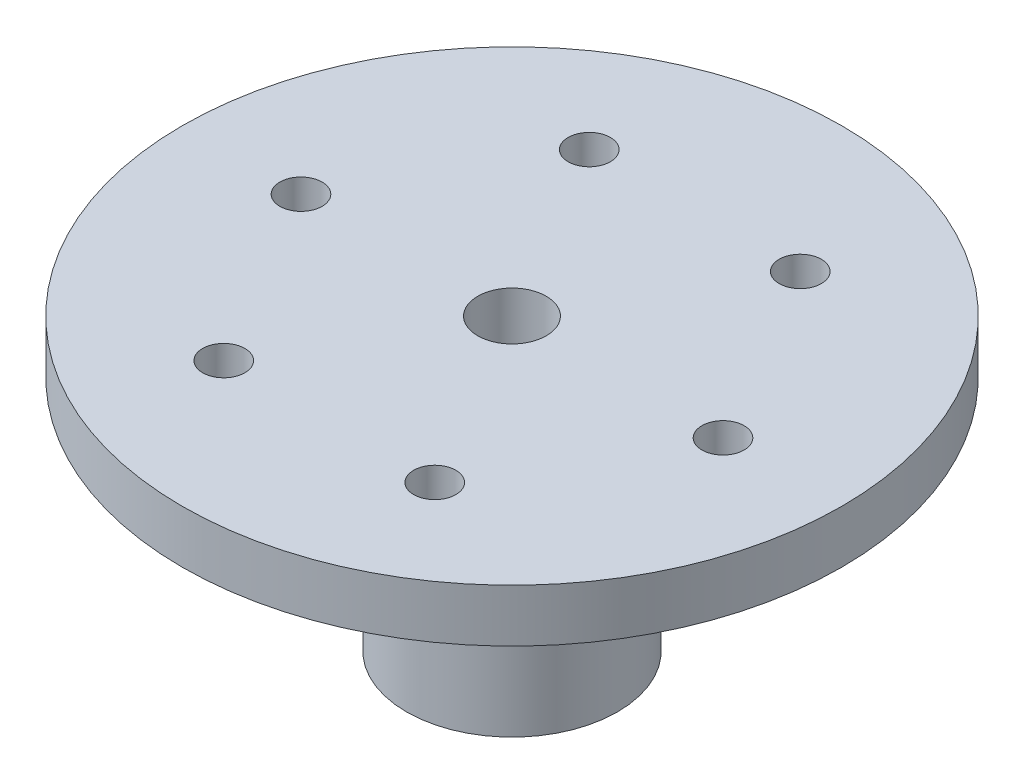
ISO-10303-21;
HEADER;
FILE_DESCRIPTION(('STEP AP214'),'2;1');
FILE_NAME('part.step','',(''),(''),'','','');
FILE_SCHEMA(('AUTOMOTIVE_DESIGN { 1 0 10303 214 1 1 1 1 }'));
ENDSEC;
DATA;
#1=APPLICATION_CONTEXT('core data for automotive mechanical design processes');
#2=APPLICATION_PROTOCOL_DEFINITION('international standard','automotive_design',2000,#1);
#3=PRODUCT_CONTEXT('',#1,'mechanical');
#4=PRODUCT('Part','Part','',(#3));
#5=PRODUCT_RELATED_PRODUCT_CATEGORY('part','',(#4));
#6=PRODUCT_DEFINITION_FORMATION('','',#4);
#7=PRODUCT_DEFINITION_CONTEXT('part definition',#1,'design');
#8=PRODUCT_DEFINITION('design','',#6,#7);
#9=PRODUCT_DEFINITION_SHAPE('','',#8);
#10=(LENGTH_UNIT() NAMED_UNIT(*) SI_UNIT(.MILLI.,.METRE.));
#11=(NAMED_UNIT(*) PLANE_ANGLE_UNIT() SI_UNIT($,.RADIAN.));
#12=(NAMED_UNIT(*) SI_UNIT($,.STERADIAN.) SOLID_ANGLE_UNIT());
#13=UNCERTAINTY_MEASURE_WITH_UNIT(LENGTH_MEASURE(1.E-05),#10,'distance_accuracy_value','');
#14=(GEOMETRIC_REPRESENTATION_CONTEXT(3) GLOBAL_UNCERTAINTY_ASSIGNED_CONTEXT((#13)) GLOBAL_UNIT_ASSIGNED_CONTEXT((#10,
#11,#12)) REPRESENTATION_CONTEXT('',''));
#15=CARTESIAN_POINT('',(0.,0.,0.));
#16=DIRECTION('',(0.,0.,1.));
#17=DIRECTION('',(1.,0.,0.));
#18=AXIS2_PLACEMENT_3D('',#15,#16,#17);
#19=CARTESIAN_POINT('',(0.,0.,0.));
#20=DIRECTION('',(0.,1.,0.));
#21=DIRECTION('',(0.,0.,1.));
#22=AXIS2_PLACEMENT_3D('',#19,#20,#21);
#23=PLANE('',#22);
#24=CARTESIAN_POINT('',(0.,0.,0.));
#25=DIRECTION('',(0.,1.,0.));
#26=DIRECTION('',(0.,0.,1.));
#27=AXIS2_PLACEMENT_3D('',#24,#25,#26);
#28=CIRCLE('',#27,8.);
#29=CARTESIAN_POINT('',(0.,0.,8.));
#30=VERTEX_POINT('',#29);
#31=EDGE_CURVE('E44',#30,#30,#28,.T.);
#32=ORIENTED_EDGE('',*,*,#31,.F.);
#33=EDGE_LOOP('',(#32));
#34=FACE_BOUND('',#33,.T.);
#35=CARTESIAN_POINT('',(0.,0.,0.));
#36=DIRECTION('',(0.,1.,0.));
#37=DIRECTION('',(0.,0.,1.));
#38=AXIS2_PLACEMENT_3D('',#35,#36,#37);
#39=CIRCLE('',#38,2.6);
#40=CARTESIAN_POINT('',(0.,0.,2.6));
#41=VERTEX_POINT('',#40);
#42=EDGE_CURVE('E49',#41,#41,#39,.T.);
#43=ORIENTED_EDGE('',*,*,#42,.T.);
#44=EDGE_LOOP('',(#43));
#45=FACE_BOUND('',#44,.T.);
#46=ADVANCED_FACE('F35',(#34,#45),#23,.F.);
#47=CARTESIAN_POINT('',(0.,18.,0.));
#48=DIRECTION('',(0.,-1.,0.));
#49=DIRECTION('',(0.,0.,-1.));
#50=AXIS2_PLACEMENT_3D('',#47,#48,#49);
#51=CYLINDRICAL_SURFACE('',#50,8.);
#52=CARTESIAN_POINT('',(0.,12.4,-8.));
#53=CARTESIAN_POINT('',(-0.13166178040528,12.3999984040242,-7.9999988680088));
#54=CARTESIAN_POINT('',(-0.263339709362447,12.3891298182017,-7.99671865110326));
#55=CARTESIAN_POINT('',(-0.522861000487809,12.3460458332446,-7.98395368949906));
#56=CARTESIAN_POINT('',(-0.650703207058272,12.3138240671627,-7.97446709423507));
#57=CARTESIAN_POINT('',(-0.898772332407242,12.2292063729436,-7.95032884002938));
#58=CARTESIAN_POINT('',(-1.0190101830326,12.1768402086097,-7.93568480400681));
#59=CARTESIAN_POINT('',(-1.24899868968501,12.0535422511107,-7.90275374780233));
#60=CARTESIAN_POINT('',(-1.35874794795147,11.9826079881673,-7.88446624307307));
#61=CARTESIAN_POINT('',(-1.56779487549399,11.8220415880437,-7.84561179508438));
#62=CARTESIAN_POINT('',(-1.66674891399095,11.7319733985825,-7.82499813851258));
#63=CARTESIAN_POINT('',(-1.84839873477318,11.5366252321437,-7.78409334736707));
#64=CARTESIAN_POINT('',(-1.93109178123905,11.4313427006001,-7.76380226759202));
#65=CARTESIAN_POINT('',(-2.07968060357932,11.2056467951398,-7.72534582390035));
#66=CARTESIAN_POINT('',(-2.14515694435541,11.0849464624148,-7.707238506622));
#67=CARTESIAN_POINT('',(-2.25474231639617,10.8336171932315,-7.6758979263045));
#68=CARTESIAN_POINT('',(-2.29885647871957,10.7029906497152,-7.66266349301297));
#69=CARTESIAN_POINT('',(-2.36322613892243,10.4393755741913,-7.64305393341495));
#70=CARTESIAN_POINT('',(-2.38411513975484,10.3065556098177,-7.63649710919253));
#71=CARTESIAN_POINT('',(-2.40341968983475,10.0391469500532,-7.63044463599628));
#72=CARTESIAN_POINT('',(-2.40184068417725,9.90455869110546,-7.63094727616914));
#73=CARTESIAN_POINT('',(-2.37675163519699,9.64258574622643,-7.63879590508444));
#74=CARTESIAN_POINT('',(-2.35403528420296,9.51511639942042,-7.64589421758625));
#75=CARTESIAN_POINT('',(-2.28859872683289,9.26588834196247,-7.66573369965799));
#76=CARTESIAN_POINT('',(-2.24587654626625,9.14413019620107,-7.67847542611761));
#77=CARTESIAN_POINT('',(-2.14105642645891,8.90783944054282,-7.70836372919957));
#78=CARTESIAN_POINT('',(-2.07870107095428,8.79342866567158,-7.72556825785523));
#79=CARTESIAN_POINT('',(-1.93656356141893,8.57642876478369,-7.76241579200103));
#80=CARTESIAN_POINT('',(-1.85677718404141,8.47384251293796,-7.78205938795186));
#81=CARTESIAN_POINT('',(-1.67810065224874,8.27890209478077,-7.822576180767));
#82=CARTESIAN_POINT('',(-1.57855185194715,8.18715413755253,-7.84346646896797));
#83=CARTESIAN_POINT('',(-1.36522121490235,8.0215136254972,-7.88339590501214));
#84=CARTESIAN_POINT('',(-1.25143848297742,7.94762219453692,-7.90243493629456));
#85=CARTESIAN_POINT('',(-1.01176806134848,7.81942412405643,-7.93669056111152));
#86=CARTESIAN_POINT('',(-0.88580439959672,7.76525197400022,-7.95188069869302));
#87=CARTESIAN_POINT('',(-0.625992664965631,7.67904065584059,-7.97653634931555));
#88=CARTESIAN_POINT('',(-0.49214680254333,7.64699531434802,-7.98600345899199));
#89=CARTESIAN_POINT('',(-0.22552358826933,7.60695651536097,-7.99789383429661));
#90=CARTESIAN_POINT('',(-0.0928801561618992,7.59814146271742,-8.00055760668464));
#91=CARTESIAN_POINT('',(0.171999369317413,7.60251064913933,-7.99924677186816));
#92=CARTESIAN_POINT('',(0.304235514705249,7.61569195144231,-7.99527305084411));
#93=CARTESIAN_POINT('',(0.561445768495515,7.66301537777839,-7.9812911517946));
#94=CARTESIAN_POINT('',(0.686516436182671,7.69667742012939,-7.97142127679063));
#95=CARTESIAN_POINT('',(0.929207422327235,7.78342917244512,-7.94678956546456));
#96=CARTESIAN_POINT('',(1.04682684324093,7.83652121766058,-7.9320271411375));
#97=CARTESIAN_POINT('',(1.27429950313768,7.96200506476981,-7.89871446962105));
#98=CARTESIAN_POINT('',(1.38391012191947,8.03481494551677,-7.88008449327424));
#99=CARTESIAN_POINT('',(1.58963729276824,8.19715960648449,-7.84117550022964));
#100=CARTESIAN_POINT('',(1.68575045176951,8.28669857902024,-7.82089607089936));
#101=CARTESIAN_POINT('',(1.86537191281642,8.48381969339099,-7.78005074990405));
#102=CARTESIAN_POINT('',(1.94829569970401,8.59193900123492,-7.75950120052411));
#103=CARTESIAN_POINT('',(2.0948639211545,8.82100470242151,-7.72122424382359));
#104=CARTESIAN_POINT('',(2.15850886127172,8.94195075929261,-7.70349676250497));
#105=CARTESIAN_POINT('',(2.26427755403453,9.19285198600803,-7.67307503381048));
#106=CARTESIAN_POINT('',(2.30650155099217,9.32276189846053,-7.660357405388));
#107=CARTESIAN_POINT('',(2.36834769304245,9.58830075028838,-7.64146550991789));
#108=CARTESIAN_POINT('',(2.38797758366279,9.72392771325286,-7.6352890005551));
#109=CARTESIAN_POINT('',(2.40355175175944,9.99097842942147,-7.63039955953247));
#110=CARTESIAN_POINT('',(2.40044888492709,10.1223418416791,-7.63138635760316));
#111=CARTESIAN_POINT('',(2.37292008710888,10.382582565441,-7.63999041913751));
#112=CARTESIAN_POINT('',(2.34849500999526,10.5114599762888,-7.64760741708721));
#113=CARTESIAN_POINT('',(2.27963022086949,10.7615126386107,-7.66841221911394));
#114=CARTESIAN_POINT('',(2.23544280811398,10.8827636597739,-7.68152967283947));
#115=CARTESIAN_POINT('',(2.12850411393718,11.1162279021132,-7.71184446244212));
#116=CARTESIAN_POINT('',(2.06574927940578,11.2284393882265,-7.72904257908064));
#117=CARTESIAN_POINT('',(1.9207802208814,11.445060986442,-7.7663628228427));
#118=CARTESIAN_POINT('',(1.83794041748797,11.5490380180163,-7.78656864262864));
#119=CARTESIAN_POINT('',(1.65627895407644,11.7419239972929,-7.82722112719253));
#120=CARTESIAN_POINT('',(1.55745314741518,11.8308290231485,-7.84766785318034));
#121=CARTESIAN_POINT('',(1.34314521949322,11.9936374596719,-7.88721498513258));
#122=CARTESIAN_POINT('',(1.22726061726498,12.0670263149688,-7.90625855625137));
#123=CARTESIAN_POINT('',(0.984226198373643,12.1931762718465,-7.94017088729242));
#124=CARTESIAN_POINT('',(0.857081684798327,12.2459470212392,-7.95504159889691));
#125=CARTESIAN_POINT('',(0.609212340248452,12.3246324410444,-7.97763479950895));
#126=CARTESIAN_POINT('',(0.489259139126775,12.3528186766132,-7.98595243809712));
#127=CARTESIAN_POINT('',(0.246208312369247,12.3905016403865,-7.99713511191184));
#128=CARTESIAN_POINT('',(0.123111215773023,12.4000014923277,-8.00000105847583));
#129=CARTESIAN_POINT('',(0.,12.4,-8.));
#130=B_SPLINE_CURVE_WITH_KNOTS('',3,(#52,#53,#54,#55,#56,#57,#58,#59,#60,#61,#62,#63,#64,#65,
#66,#67,#68,#69,#70,#71,#72,#73,#74,#75,#76,#77,#78,#79,#80,#81,#82,#83,#84,#85,#86,#87,#88,#89,
#90,#91,#92,#93,#94,#95,#96,#97,#98,#99,#100,#101,#102,#103,#104,#105,#106,#107,#108,#109,#110,
#111,#112,#113,#114,#115,#116,#117,#118,#119,#120,#121,#122,#123,#124,#125,#126,#127,#128,#129),
.UNSPECIFIED.,.T.,.F.,(4,2,2,2,2,2,2,2,2,2,2,2,2,2,2,2,2,2,2,2,2,2,2,2,2,2,2,2,2,2,2,2,2,2,2,2,
2,2,4),(0.,0.394533125780177,0.789183943753599,1.1832538820814,1.57737626306032,
1.98168964717106,2.38607099661813,2.79954369606574,3.21291703269158,3.61471502970558,
4.01641565310543,4.40361626716281,4.79085509852802,5.18339882315391,5.57603776253689,
5.98507366477067,6.39413530449714,6.80593675010702,7.21762325646092,7.61454095101672,
8.01140565680523,8.39930794691723,8.78725687349966,9.18418089124653,9.58120451200306,
9.99264640516509,10.4040775080429,10.81356503922,11.2229121513645,11.6152024875083,
12.0074771146586,12.3948806465165,12.7823583609227,13.1839508109519,13.585647598433,
13.9990879385797,14.4123345855967,14.7813070709603,15.150217871255),.UNSPECIFIED.);
#131=CARTESIAN_POINT('',(0.,12.4,-8.));
#132=VERTEX_POINT('',#131);
#133=EDGE_CURVE('E60',#132,#132,#130,.T.);
#134=ORIENTED_EDGE('',*,*,#133,.T.);
#135=EDGE_LOOP('',(#134));
#136=FACE_BOUND('',#135,.T.);
#137=CARTESIAN_POINT('',(0.,18.,0.));
#138=DIRECTION('',(0.,1.,0.));
#139=DIRECTION('',(0.,0.,1.));
#140=AXIS2_PLACEMENT_3D('',#137,#138,#139);
#141=CIRCLE('',#140,8.);
#142=CARTESIAN_POINT('',(0.,18.,8.));
#143=VERTEX_POINT('',#142);
#144=EDGE_CURVE('E10',#143,#143,#141,.T.);
#145=ORIENTED_EDGE('',*,*,#144,.F.);
#146=EDGE_LOOP('',(#145));
#147=FACE_BOUND('',#146,.T.);
#148=ORIENTED_EDGE('',*,*,#31,.T.);
#149=EDGE_LOOP('',(#148));
#150=FACE_BOUND('',#149,.T.);
#151=ADVANCED_FACE('F37',(#136,#147,#150),#51,.T.);
#152=CARTESIAN_POINT('',(0.,18.,0.));
#153=DIRECTION('',(0.,-1.,0.));
#154=DIRECTION('',(0.,0.,-1.));
#155=AXIS2_PLACEMENT_3D('',#152,#153,#154);
#156=CYLINDRICAL_SURFACE('',#155,2.6);
#157=CARTESIAN_POINT('',(0.,12.4,-2.6));
#158=CARTESIAN_POINT('',(-0.110253293289517,12.3999918557324,-2.59999193091976));
#159=CARTESIAN_POINT('',(-0.220578358244194,12.3923396404243,-2.59292376288972));
#160=CARTESIAN_POINT('',(-0.437496805693456,12.36233565564,-2.56526750690049));
#161=CARTESIAN_POINT('',(-0.544085759557477,12.3399670238822,-2.54466390989173));
#162=CARTESIAN_POINT('',(-0.74979699498979,12.2823557462199,-2.49178998062185));
#163=CARTESIAN_POINT('',(-0.848963357748623,12.2471978373515,-2.4595964531508));
#164=CARTESIAN_POINT('',(-1.03881942943321,12.165995582834,-2.38563585985758));
#165=CARTESIAN_POINT('',(-1.12950597486161,12.1199471967932,-2.34386524108891));
#166=CARTESIAN_POINT('',(-1.33628329340981,11.9984870166154,-2.2344982810976));
#167=CARTESIAN_POINT('',(-1.44789529541141,11.9187185518003,-2.1632761864279));
#168=CARTESIAN_POINT('',(-1.65259463663395,11.7455634384784,-2.01128516755018));
#169=CARTESIAN_POINT('',(-1.74563749150799,11.6521449949053,-1.93049403964585));
#170=CARTESIAN_POINT('',(-1.91578353736409,11.4517247963353,-1.7619308261401));
#171=CARTESIAN_POINT('',(-1.99243414172537,11.3444436060945,-1.67403529419028));
#172=CARTESIAN_POINT('',(-2.09359001406653,11.1752338022373,-1.54270757935254));
#173=CARTESIAN_POINT('',(-2.12499174782237,11.1174834178291,-1.49904160814595));
#174=CARTESIAN_POINT('',(-2.18323658091873,10.9989212370194,-1.41285960541424));
#175=CARTESIAN_POINT('',(-2.21008196509532,10.9381109949732,-1.37034300656918));
#176=CARTESIAN_POINT('',(-2.25843926672024,10.814692854847,-1.2890403557874));
#177=CARTESIAN_POINT('',(-2.28007914215949,10.7521825156896,-1.25018329889018));
#178=CARTESIAN_POINT('',(-2.31869327576771,10.6230600987196,-1.17701513661225));
#179=CARTESIAN_POINT('',(-2.33566673139453,10.5564473177675,-1.14270481371476));
#180=CARTESIAN_POINT('',(-2.36199331033766,10.4295141888592,-1.08709725093047));
#181=CARTESIAN_POINT('',(-2.37213286185081,10.369904087534,-1.06459469789769));
#182=CARTESIAN_POINT('',(-2.38799151571338,10.2475229275543,-1.02854070687548));
#183=CARTESIAN_POINT('',(-2.39372618070245,10.1847638397451,-1.01495778040557));
#184=CARTESIAN_POINT('',(-2.39967397973977,10.067044078534,-1.00080884778861));
#185=CARTESIAN_POINT('',(-2.40058615721642,10.0123252692066,-0.998596287013188));
#186=CARTESIAN_POINT('',(-2.39867279663049,9.90333317636697,-1.00318129599667));
#187=CARTESIAN_POINT('',(-2.39584554880426,9.84906010807859,-1.00998298731168));
#188=CARTESIAN_POINT('',(-2.38526167036109,9.72512501226766,-1.03477209113681));
#189=CARTESIAN_POINT('',(-2.37620361223052,9.65618136967142,-1.05567207158032));
#190=CARTESIAN_POINT('',(-2.35300223384909,9.52247069801654,-1.1064130282759));
#191=CARTESIAN_POINT('',(-2.33883559809615,9.45772445084281,-1.13629489194383));
#192=CARTESIAN_POINT('',(-2.30615209349664,9.33227993842859,-1.20124426916695));
#193=CARTESIAN_POINT('',(-2.28764231813448,9.27157527758293,-1.23630329281943));
#194=CARTESIAN_POINT('',(-2.2465890600595,9.15338636981,-1.30942760754397));
#195=CARTESIAN_POINT('',(-2.22404158193293,9.09590538746096,-1.3474958552898));
#196=CARTESIAN_POINT('',(-2.17504555153213,8.98366955786592,-1.42523427951782));
#197=CARTESIAN_POINT('',(-2.14859273942495,8.928917775909,-1.46490617045621));
#198=CARTESIAN_POINT('',(-2.09183122908232,8.82190358047085,-1.54487863517501));
#199=CARTESIAN_POINT('',(-2.06152110778427,8.76964209555552,-1.58517943613796));
#200=CARTESIAN_POINT('',(-1.99271328297664,8.6606792914496,-1.6710807554743));
#201=CARTESIAN_POINT('',(-1.95366273708307,8.6043161507154,-1.71667083412421));
#202=CARTESIAN_POINT('',(-1.87049363339439,8.49467918595236,-1.80693925540124));
#203=CARTESIAN_POINT('',(-1.82637321253715,8.44140650848899,-1.85161725571231));
#204=CARTESIAN_POINT('',(-1.68638143299502,8.28668868319559,-1.98303967030674));
#205=CARTESIAN_POINT('',(-1.58267932816001,8.19002290778821,-2.06743236944323));
#206=CARTESIAN_POINT('',(-1.38038763130332,8.03355745438999,-2.20588425623087));
#207=CARTESIAN_POINT('',(-1.28611136869555,7.97039279465733,-2.2624551065853));
#208=CARTESIAN_POINT('',(-1.08527168664129,7.85629407273712,-2.3653459383943));
#209=CARTESIAN_POINT('',(-0.978722184030967,7.80534635576523,-2.41167735979777));
#210=CARTESIAN_POINT('',(-0.772707839781748,7.72555337753424,-2.48453014238678));
#211=CARTESIAN_POINT('',(-0.674813375292449,7.6944811401753,-2.51303059624425));
#212=CARTESIAN_POINT('',(-0.473332895418684,7.6448579441416,-2.55863187017592));
#213=CARTESIAN_POINT('',(-0.369750579910114,7.62629894770149,-2.57574000791218));
#214=CARTESIAN_POINT('',(-0.159283116503703,7.60294393470139,-2.59727878899119));
#215=CARTESIAN_POINT('',(-0.0523863121799385,7.59820384387449,-2.6016579172499));
#216=CARTESIAN_POINT('',(0.160804104888001,7.60302073083945,-2.59721172742758));
#217=CARTESIAN_POINT('',(0.267097718944851,7.61257767750584,-2.58838643809333));
#218=CARTESIAN_POINT('',(0.468952574023296,7.64418775502277,-2.55926097628564));
#219=CARTESIAN_POINT('',(0.564763759450772,7.66539472845559,-2.53973801139653));
#220=CARTESIAN_POINT('',(0.750808078141295,7.71840870405212,-2.49109400235789));
#221=CARTESIAN_POINT('',(0.84103936421535,7.75021919440582,-2.46196979976829));
#222=CARTESIAN_POINT('',(1.04489117984069,7.83567386134654,-2.38409135236303));
#223=CARTESIAN_POINT('',(1.15568187442301,7.89306342215937,-2.33203362261787));
#224=CARTESIAN_POINT('',(1.36322831741091,8.02097381422857,-2.21715221253679));
#225=CARTESIAN_POINT('',(1.45995362534403,8.09152239326382,-2.15430580536992));
#226=CARTESIAN_POINT('',(1.66892572651374,8.26819684892617,-1.99918166897158));
#227=CARTESIAN_POINT('',(1.77566718986987,8.37835893267276,-1.90405916898402));
#228=CARTESIAN_POINT('',(1.91739234463406,8.55456092391541,-1.75734441894713));
#229=CARTESIAN_POINT('',(1.96159995235626,8.6151788478256,-1.70772279483686));
#230=CARTESIAN_POINT('',(2.04404915895271,8.74005741862563,-1.60811423616925));
#231=CARTESIAN_POINT('',(2.08229321812292,8.80431654831816,-1.55812746121455));
#232=CARTESIAN_POINT('',(2.16162320035268,8.95302260121251,-1.44676812621891));
#233=CARTESIAN_POINT('',(2.20106894756233,9.03852911631936,-1.38564029210198));
#234=CARTESIAN_POINT('',(2.27055866944337,9.21660802190689,-1.26851620063005));
#235=CARTESIAN_POINT('',(2.30062004216201,9.3091669363669,-1.21251058500128));
#236=CARTESIAN_POINT('',(2.34009171220948,9.4638416828509,-1.13360869748151));
#237=CARTESIAN_POINT('',(2.35291834062775,9.52291090729741,-1.10654344583984));
#238=CARTESIAN_POINT('',(2.37434363553045,9.6446263086212,-1.05978852638494));
#239=CARTESIAN_POINT('',(2.38295289092549,9.70726308166579,-1.04008041632745));
#240=CARTESIAN_POINT('',(2.39411505189458,9.82395094040137,-1.01409245185054));
#241=CARTESIAN_POINT('',(2.39748075331609,9.87751046704464,-1.00603064319251));
#242=CARTESIAN_POINT('',(2.40055871895834,9.98531358361526,-0.998668140367301));
#243=CARTESIAN_POINT('',(2.40027508464513,10.0395563371541,-0.999357610679622));
#244=CARTESIAN_POINT('',(2.39610268908879,10.1468846163791,-1.00931366541283));
#245=CARTESIAN_POINT('',(2.39222530316321,10.1999732528055,-1.01855318617561));
#246=CARTESIAN_POINT('',(2.38123071725832,10.3041275847833,-1.04399805407571));
#247=CARTESIAN_POINT('',(2.37410701829025,10.3551889979177,-1.06021737084191));
#248=CARTESIAN_POINT('',(2.34933382375152,10.4999252716421,-1.11450341987781));
#249=CARTESIAN_POINT('',(2.32798766114701,10.5904568872773,-1.15907490415583));
#250=CARTESIAN_POINT('',(2.27682500682951,10.764423415576,-1.25664460610283));
#251=CARTESIAN_POINT('',(2.24696634405408,10.8478202390575,-1.30968418438331));
#252=CARTESIAN_POINT('',(2.18195995977194,11.0027635603981,-1.41513387523201));
#253=CARTESIAN_POINT('',(2.14738611380935,11.0747290294703,-1.46728589141297));
#254=CARTESIAN_POINT('',(2.07158513226751,11.2144371136431,-1.5724972645583));
#255=CARTESIAN_POINT('',(2.0303531890692,11.2821766279342,-1.625557252204));
#256=CARTESIAN_POINT('',(1.94123743768396,11.413462059328,-1.7309987056811));
#257=CARTESIAN_POINT('',(1.89336536403635,11.4770150888525,-1.7833811940717));
#258=CARTESIAN_POINT('',(1.79076266755269,11.5998665547735,-1.88638727962579));
#259=CARTESIAN_POINT('',(1.73603188654214,11.6591648929994,-1.93701083619066));
#260=CARTESIAN_POINT('',(1.59229958807784,11.799687716632,-2.05842117330693));
#261=CARTESIAN_POINT('',(1.4992241930891,11.8782305736681,-2.1275927969963));
#262=CARTESIAN_POINT('',(1.29775625472815,12.0226540091058,-2.25611573429647));
#263=CARTESIAN_POINT('',(1.1893877134437,12.0885540546991,-2.31548212591208));
#264=CARTESIAN_POINT('',(0.9811912905307,12.1927127727199,-2.40989832317532));
#265=CARTESIAN_POINT('',(0.883950072299776,12.2338621546802,-2.44743605504096));
#266=CARTESIAN_POINT('',(0.681632508874096,12.3036428153785,-2.51128871574601));
#267=CARTESIAN_POINT('',(0.576569362726033,12.3322946465948,-2.53762206865235));
#268=CARTESIAN_POINT('',(0.392560085780078,12.3689600340916,-2.57136886284367));
#269=CARTESIAN_POINT('',(0.314908466872286,12.3805528035406,-2.58205782876094));
#270=CARTESIAN_POINT('',(0.158183649855952,12.396076117517,-2.59637666918156));
#271=CARTESIAN_POINT('',(0.0791103008430451,12.4000058437752,-2.60000578982583));
#272=CARTESIAN_POINT('',(0.,12.4,-2.6));
#273=B_SPLINE_CURVE_WITH_KNOTS('',3,(#157,#158,#159,#160,#161,#162,#163,#164,#165,#166,#167,
#168,#169,#170,#171,#172,#173,#174,#175,#176,#177,#178,#179,#180,#181,#182,#183,#184,#185,#186,
#187,#188,#189,#190,#191,#192,#193,#194,#195,#196,#197,#198,#199,#200,#201,#202,#203,#204,#205,
#206,#207,#208,#209,#210,#211,#212,#213,#214,#215,#216,#217,#218,#219,#220,#221,#222,#223,#224,
#225,#226,#227,#228,#229,#230,#231,#232,#233,#234,#235,#236,#237,#238,#239,#240,#241,#242,#243,
#244,#245,#246,#247,#248,#249,#250,#251,#252,#253,#254,#255,#256,#257,#258,#259,#260,#261,#262,
#263,#264,#265,#266,#267,#268,#269,#270,#271,#272),.UNSPECIFIED.,.T.,.F.,(4,2,2,2,2,2,2,2,2,2,2,
2,2,2,2,2,2,2,2,2,2,2,2,2,2,2,2,2,2,2,2,2,2,2,2,2,2,2,2,2,2,2,2,2,2,2,2,2,2,2,2,2,2,2,2,2,2,4),
(0.,0.330415872296247,0.661211000760351,0.989853175087199,1.31861746820501,1.7797935147992,
2.24206143480355,2.71579490088812,2.95240011262137,3.18888632301922,3.41877142427527,
3.64869603702868,3.84165352651085,4.03392611324847,4.19736571510115,4.36088007167967,
4.57743120465817,4.79498345028965,5.01218281947091,5.22959831289622,5.44725273383049,
5.66498768724787,5.91177833175517,6.15865995791654,6.65105940002156,7.03016806254222,
7.40885100227688,7.72727871784581,8.04550169893705,8.36501076705412,8.68451913958264,
8.98341004708607,9.28239937654632,9.68575425512448,10.0899694860178,10.6283593773976,
10.8980233591214,11.1675757934023,11.5038566860295,11.8395103805391,12.0377744187649,
12.2355380743845,12.3975975819128,12.5594749676798,12.7208417057474,12.8825329224629,
13.1901897431276,13.4993980050284,13.7851239531332,14.0710571458846,14.356491322833,
14.6419320836343,15.0605782771146,15.4785745792677,15.813453065096,16.1477787407829,
16.3848374947218,16.621921560701),.UNSPECIFIED.);
#274=CARTESIAN_POINT('',(0.,12.4,-2.6));
#275=VERTEX_POINT('',#274);
#276=EDGE_CURVE('E53',#275,#275,#273,.T.);
#277=ORIENTED_EDGE('',*,*,#276,.F.);
#278=EDGE_LOOP('',(#277));
#279=FACE_BOUND('',#278,.T.);
#280=ORIENTED_EDGE('',*,*,#42,.F.);
#281=EDGE_LOOP('',(#280));
#282=FACE_BOUND('',#281,.T.);
#283=CARTESIAN_POINT('',(0.,22.,0.));
#284=DIRECTION('',(0.,1.,0.));
#285=DIRECTION('',(0.,0.,1.));
#286=AXIS2_PLACEMENT_3D('',#283,#284,#285);
#287=CIRCLE('',#286,2.6);
#288=CARTESIAN_POINT('',(0.,22.,2.6));
#289=VERTEX_POINT('',#288);
#290=EDGE_CURVE('E40',#289,#289,#287,.T.);
#291=ORIENTED_EDGE('',*,*,#290,.T.);
#292=EDGE_LOOP('',(#291));
#293=FACE_BOUND('',#292,.T.);
#294=ADVANCED_FACE('F61',(#279,#282,#293),#156,.F.);
#295=CARTESIAN_POINT('',(0.,22.,0.));
#296=DIRECTION('',(0.,1.,0.));
#297=DIRECTION('',(0.,0.,1.));
#298=AXIS2_PLACEMENT_3D('',#295,#296,#297);
#299=PLANE('',#298);
#300=ORIENTED_EDGE('',*,*,#290,.F.);
#301=EDGE_LOOP('',(#300));
#302=FACE_BOUND('',#301,.T.);
#303=CARTESIAN_POINT('',(-7.99999999999987,22.,-13.8564064605511));
#304=DIRECTION('',(0.,1.,0.));
#305=DIRECTION('',(0.,0.,1.));
#306=AXIS2_PLACEMENT_3D('',#303,#304,#305);
#307=CIRCLE('',#306,1.6);
#308=CARTESIAN_POINT('',(-7.99999999999987,22.,-12.2564064605511));
#309=VERTEX_POINT('',#308);
#310=EDGE_CURVE('E85',#309,#309,#307,.T.);
#311=ORIENTED_EDGE('',*,*,#310,.F.);
#312=EDGE_LOOP('',(#311));
#313=FACE_BOUND('',#312,.T.);
#314=CARTESIAN_POINT('',(-8.00000000000007,22.,13.856406460551));
#315=DIRECTION('',(0.,1.,0.));
#316=DIRECTION('',(0.,0.,1.));
#317=AXIS2_PLACEMENT_3D('',#314,#315,#316);
#318=CIRCLE('',#317,1.6);
#319=CARTESIAN_POINT('',(-8.00000000000007,22.,15.456406460551));
#320=VERTEX_POINT('',#319);
#321=EDGE_CURVE('E97',#320,#320,#318,.T.);
#322=ORIENTED_EDGE('',*,*,#321,.F.);
#323=EDGE_LOOP('',(#322));
#324=FACE_BOUND('',#323,.T.);
#325=CARTESIAN_POINT('',(16.,22.,0.));
#326=DIRECTION('',(0.,1.,0.));
#327=DIRECTION('',(0.,0.,1.));
#328=AXIS2_PLACEMENT_3D('',#325,#326,#327);
#329=CIRCLE('',#328,1.6);
#330=CARTESIAN_POINT('',(16.,22.,1.6));
#331=VERTEX_POINT('',#330);
#332=EDGE_CURVE('E109',#331,#331,#329,.T.);
#333=ORIENTED_EDGE('',*,*,#332,.F.);
#334=EDGE_LOOP('',(#333));
#335=FACE_BOUND('',#334,.T.);
#336=CARTESIAN_POINT('',(0.,22.,0.));
#337=DIRECTION('',(0.,1.,0.));
#338=DIRECTION('',(0.,0.,1.));
#339=AXIS2_PLACEMENT_3D('',#336,#337,#338);
#340=CIRCLE('',#339,25.);
#341=CARTESIAN_POINT('',(0.,22.,25.));
#342=VERTEX_POINT('',#341);
#343=EDGE_CURVE('E115',#342,#342,#340,.T.);
#344=ORIENTED_EDGE('',*,*,#343,.T.);
#345=EDGE_LOOP('',(#344));
#346=FACE_BOUND('',#345,.T.);
#347=CARTESIAN_POINT('',(7.99999999999997,22.,13.856406460551));
#348=DIRECTION('',(0.,1.,0.));
#349=DIRECTION('',(0.,0.,1.));
#350=AXIS2_PLACEMENT_3D('',#347,#348,#349);
#351=CIRCLE('',#350,1.6);
#352=CARTESIAN_POINT('',(7.99999999999997,22.,15.456406460551));
#353=VERTEX_POINT('',#352);
#354=EDGE_CURVE('E103',#353,#353,#351,.T.);
#355=ORIENTED_EDGE('',*,*,#354,.F.);
#356=EDGE_LOOP('',(#355));
#357=FACE_BOUND('',#356,.T.);
#358=CARTESIAN_POINT('',(-16.,22.,-1.1172740284298E-13));
#359=DIRECTION('',(0.,1.,0.));
#360=DIRECTION('',(0.,0.,1.));
#361=AXIS2_PLACEMENT_3D('',#358,#359,#360);
#362=CIRCLE('',#361,1.6);
#363=CARTESIAN_POINT('',(-16.,22.,1.59999999999989));
#364=VERTEX_POINT('',#363);
#365=EDGE_CURVE('E91',#364,#364,#362,.T.);
#366=ORIENTED_EDGE('',*,*,#365,.F.);
#367=EDGE_LOOP('',(#366));
#368=FACE_BOUND('',#367,.T.);
#369=CARTESIAN_POINT('',(8.00000000000016,22.,-13.8564064605509));
#370=DIRECTION('',(0.,1.,0.));
#371=DIRECTION('',(0.,0.,1.));
#372=AXIS2_PLACEMENT_3D('',#369,#370,#371);
#373=CIRCLE('',#372,1.6);
#374=CARTESIAN_POINT('',(8.00000000000016,22.,-12.2564064605509));
#375=VERTEX_POINT('',#374);
#376=EDGE_CURVE('E79',#375,#375,#373,.T.);
#377=ORIENTED_EDGE('',*,*,#376,.F.);
#378=EDGE_LOOP('',(#377));
#379=FACE_BOUND('',#378,.T.);
#380=ADVANCED_FACE('F125',(#302,#313,#324,#335,#346,#357,#368,#379),#299,.T.);
#381=CARTESIAN_POINT('',(0.,18.,0.));
#382=DIRECTION('',(0.,1.,0.));
#383=DIRECTION('',(0.,0.,1.));
#384=AXIS2_PLACEMENT_3D('',#381,#382,#383);
#385=PLANE('',#384);
#386=ORIENTED_EDGE('',*,*,#144,.T.);
#387=EDGE_LOOP('',(#386));
#388=FACE_BOUND('',#387,.T.);
#389=CARTESIAN_POINT('',(0.,18.,0.));
#390=DIRECTION('',(0.,1.,0.));
#391=DIRECTION('',(0.,0.,1.));
#392=AXIS2_PLACEMENT_3D('',#389,#390,#391);
#393=CIRCLE('',#392,25.);
#394=CARTESIAN_POINT('',(0.,18.,25.));
#395=VERTEX_POINT('',#394);
#396=EDGE_CURVE('E112',#395,#395,#393,.T.);
#397=ORIENTED_EDGE('',*,*,#396,.F.);
#398=EDGE_LOOP('',(#397));
#399=FACE_BOUND('',#398,.T.);
#400=CARTESIAN_POINT('',(16.,18.,0.));
#401=DIRECTION('',(0.,1.,0.));
#402=DIRECTION('',(0.,0.,1.));
#403=AXIS2_PLACEMENT_3D('',#400,#401,#402);
#404=CIRCLE('',#403,1.6);
#405=CARTESIAN_POINT('',(16.,18.,1.6));
#406=VERTEX_POINT('',#405);
#407=EDGE_CURVE('E106',#406,#406,#404,.T.);
#408=ORIENTED_EDGE('',*,*,#407,.T.);
#409=EDGE_LOOP('',(#408));
#410=FACE_BOUND('',#409,.T.);
#411=CARTESIAN_POINT('',(7.99999999999997,18.,13.856406460551));
#412=DIRECTION('',(0.,1.,0.));
#413=DIRECTION('',(0.,0.,1.));
#414=AXIS2_PLACEMENT_3D('',#411,#412,#413);
#415=CIRCLE('',#414,1.6);
#416=CARTESIAN_POINT('',(7.99999999999997,18.,15.456406460551));
#417=VERTEX_POINT('',#416);
#418=EDGE_CURVE('E100',#417,#417,#415,.T.);
#419=ORIENTED_EDGE('',*,*,#418,.T.);
#420=EDGE_LOOP('',(#419));
#421=FACE_BOUND('',#420,.T.);
#422=CARTESIAN_POINT('',(-8.00000000000007,18.,13.856406460551));
#423=DIRECTION('',(0.,1.,0.));
#424=DIRECTION('',(0.,0.,1.));
#425=AXIS2_PLACEMENT_3D('',#422,#423,#424);
#426=CIRCLE('',#425,1.6);
#427=CARTESIAN_POINT('',(-8.00000000000007,18.,15.456406460551));
#428=VERTEX_POINT('',#427);
#429=EDGE_CURVE('E94',#428,#428,#426,.T.);
#430=ORIENTED_EDGE('',*,*,#429,.T.);
#431=EDGE_LOOP('',(#430));
#432=FACE_BOUND('',#431,.T.);
#433=CARTESIAN_POINT('',(-16.,18.,-1.1172740284298E-13));
#434=DIRECTION('',(0.,1.,0.));
#435=DIRECTION('',(0.,0.,1.));
#436=AXIS2_PLACEMENT_3D('',#433,#434,#435);
#437=CIRCLE('',#436,1.6);
#438=CARTESIAN_POINT('',(-16.,18.,1.59999999999989));
#439=VERTEX_POINT('',#438);
#440=EDGE_CURVE('E88',#439,#439,#437,.T.);
#441=ORIENTED_EDGE('',*,*,#440,.T.);
#442=EDGE_LOOP('',(#441));
#443=FACE_BOUND('',#442,.T.);
#444=CARTESIAN_POINT('',(-7.99999999999987,18.,-13.8564064605511));
#445=DIRECTION('',(0.,1.,0.));
#446=DIRECTION('',(0.,0.,1.));
#447=AXIS2_PLACEMENT_3D('',#444,#445,#446);
#448=CIRCLE('',#447,1.6);
#449=CARTESIAN_POINT('',(-7.99999999999987,18.,-12.2564064605511));
#450=VERTEX_POINT('',#449);
#451=EDGE_CURVE('E82',#450,#450,#448,.T.);
#452=ORIENTED_EDGE('',*,*,#451,.T.);
#453=EDGE_LOOP('',(#452));
#454=FACE_BOUND('',#453,.T.);
#455=CARTESIAN_POINT('',(8.00000000000016,18.,-13.8564064605509));
#456=DIRECTION('',(0.,1.,0.));
#457=DIRECTION('',(0.,0.,1.));
#458=AXIS2_PLACEMENT_3D('',#455,#456,#457);
#459=CIRCLE('',#458,1.6);
#460=CARTESIAN_POINT('',(8.00000000000016,18.,-12.2564064605509));
#461=VERTEX_POINT('',#460);
#462=EDGE_CURVE('E78',#461,#461,#459,.T.);
#463=ORIENTED_EDGE('',*,*,#462,.T.);
#464=EDGE_LOOP('',(#463));
#465=FACE_BOUND('',#464,.T.);
#466=ADVANCED_FACE('F122',(#388,#399,#410,#421,#432,#443,#454,#465),#385,.F.);
#467=CARTESIAN_POINT('',(0.,22.,0.));
#468=DIRECTION('',(0.,-1.,0.));
#469=DIRECTION('',(0.,0.,-1.));
#470=AXIS2_PLACEMENT_3D('',#467,#468,#469);
#471=CYLINDRICAL_SURFACE('',#470,25.);
#472=ORIENTED_EDGE('',*,*,#343,.F.);
#473=EDGE_LOOP('',(#472));
#474=FACE_BOUND('',#473,.T.);
#475=ORIENTED_EDGE('',*,*,#396,.T.);
#476=EDGE_LOOP('',(#475));
#477=FACE_BOUND('',#476,.T.);
#478=ADVANCED_FACE('F120',(#474,#477),#471,.T.);
#479=CARTESIAN_POINT('',(16.,22.,0.));
#480=DIRECTION('',(0.,-1.,0.));
#481=DIRECTION('',(0.,0.,-1.));
#482=AXIS2_PLACEMENT_3D('',#479,#480,#481);
#483=CYLINDRICAL_SURFACE('',#482,1.6);
#484=ORIENTED_EDGE('',*,*,#332,.T.);
#485=EDGE_LOOP('',(#484));
#486=FACE_BOUND('',#485,.T.);
#487=ORIENTED_EDGE('',*,*,#407,.F.);
#488=EDGE_LOOP('',(#487));
#489=FACE_BOUND('',#488,.T.);
#490=ADVANCED_FACE('F194',(#486,#489),#483,.F.);
#491=CARTESIAN_POINT('',(7.99999999999997,22.,13.856406460551));
#492=DIRECTION('',(0.,-1.,0.));
#493=DIRECTION('',(0.,0.,-1.));
#494=AXIS2_PLACEMENT_3D('',#491,#492,#493);
#495=CYLINDRICAL_SURFACE('',#494,1.6);
#496=ORIENTED_EDGE('',*,*,#354,.T.);
#497=EDGE_LOOP('',(#496));
#498=FACE_BOUND('',#497,.T.);
#499=ORIENTED_EDGE('',*,*,#418,.F.);
#500=EDGE_LOOP('',(#499));
#501=FACE_BOUND('',#500,.T.);
#502=ADVANCED_FACE('F188',(#498,#501),#495,.F.);
#503=CARTESIAN_POINT('',(-8.00000000000007,22.,13.856406460551));
#504=DIRECTION('',(0.,-1.,0.));
#505=DIRECTION('',(0.,0.,-1.));
#506=AXIS2_PLACEMENT_3D('',#503,#504,#505);
#507=CYLINDRICAL_SURFACE('',#506,1.6);
#508=ORIENTED_EDGE('',*,*,#321,.T.);
#509=EDGE_LOOP('',(#508));
#510=FACE_BOUND('',#509,.T.);
#511=ORIENTED_EDGE('',*,*,#429,.F.);
#512=EDGE_LOOP('',(#511));
#513=FACE_BOUND('',#512,.T.);
#514=ADVANCED_FACE('F183',(#510,#513),#507,.F.);
#515=CARTESIAN_POINT('',(-16.,22.,-1.1172740284298E-13));
#516=DIRECTION('',(0.,-1.,0.));
#517=DIRECTION('',(0.,0.,-1.));
#518=AXIS2_PLACEMENT_3D('',#515,#516,#517);
#519=CYLINDRICAL_SURFACE('',#518,1.6);
#520=ORIENTED_EDGE('',*,*,#365,.T.);
#521=EDGE_LOOP('',(#520));
#522=FACE_BOUND('',#521,.T.);
#523=ORIENTED_EDGE('',*,*,#440,.F.);
#524=EDGE_LOOP('',(#523));
#525=FACE_BOUND('',#524,.T.);
#526=ADVANCED_FACE('F145',(#522,#525),#519,.F.);
#527=CARTESIAN_POINT('',(-7.99999999999987,22.,-13.8564064605511));
#528=DIRECTION('',(0.,-1.,0.));
#529=DIRECTION('',(0.,0.,-1.));
#530=AXIS2_PLACEMENT_3D('',#527,#528,#529);
#531=CYLINDRICAL_SURFACE('',#530,1.6);
#532=ORIENTED_EDGE('',*,*,#310,.T.);
#533=EDGE_LOOP('',(#532));
#534=FACE_BOUND('',#533,.T.);
#535=ORIENTED_EDGE('',*,*,#451,.F.);
#536=EDGE_LOOP('',(#535));
#537=FACE_BOUND('',#536,.T.);
#538=ADVANCED_FACE('F140',(#534,#537),#531,.F.);
#539=CARTESIAN_POINT('',(8.00000000000016,22.,-13.8564064605509));
#540=DIRECTION('',(0.,-1.,0.));
#541=DIRECTION('',(0.,0.,-1.));
#542=AXIS2_PLACEMENT_3D('',#539,#540,#541);
#543=CYLINDRICAL_SURFACE('',#542,1.6);
#544=ORIENTED_EDGE('',*,*,#376,.T.);
#545=EDGE_LOOP('',(#544));
#546=FACE_BOUND('',#545,.T.);
#547=ORIENTED_EDGE('',*,*,#462,.F.);
#548=EDGE_LOOP('',(#547));
#549=FACE_BOUND('',#548,.T.);
#550=ADVANCED_FACE('F68',(#546,#549),#543,.F.);
#551=CARTESIAN_POINT('',(0.,10.,-10.));
#552=DIRECTION('',(0.,0.,1.));
#553=DIRECTION('',(1.,0.,0.));
#554=AXIS2_PLACEMENT_3D('',#551,#552,#553);
#555=CYLINDRICAL_SURFACE('',#554,2.4);
#556=ORIENTED_EDGE('',*,*,#276,.T.);
#557=EDGE_LOOP('',(#556));
#558=FACE_BOUND('',#557,.T.);
#559=ORIENTED_EDGE('',*,*,#133,.F.);
#560=EDGE_LOOP('',(#559));
#561=FACE_BOUND('',#560,.T.);
#562=ADVANCED_FACE('F64',(#558,#561),#555,.F.);
#563=CLOSED_SHELL('',(#46,#151,#294,#380,#466,#478,#490,#502,#514,#526,#538,#550,#562));
#564=MANIFOLD_SOLID_BREP('B2',#563);
#565=ADVANCED_BREP_SHAPE_REPRESENTATION('',(#18,#564),#14);
#566=SHAPE_DEFINITION_REPRESENTATION(#9,#565);
ENDSEC;
END-ISO-10303-21;
